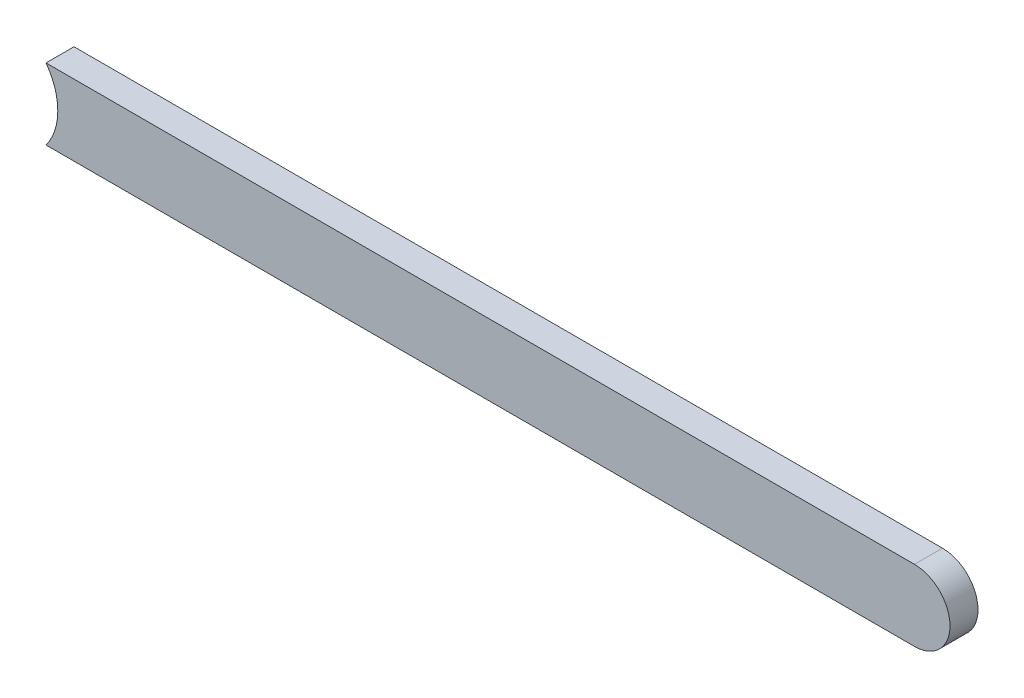
ISO-10303-21;
HEADER;
FILE_DESCRIPTION(('STEP AP214'),'2;1');
FILE_NAME('part.step','',(''),(''),'','','');
FILE_SCHEMA(('AUTOMOTIVE_DESIGN { 1 0 10303 214 1 1 1 1 }'));
ENDSEC;
DATA;
#1=APPLICATION_CONTEXT('core data for automotive mechanical design processes');
#2=APPLICATION_PROTOCOL_DEFINITION('international standard','automotive_design',2000,#1);
#3=PRODUCT_CONTEXT('',#1,'mechanical');
#4=PRODUCT('Part','Part','',(#3));
#5=PRODUCT_RELATED_PRODUCT_CATEGORY('part','',(#4));
#6=PRODUCT_DEFINITION_FORMATION('','',#4);
#7=PRODUCT_DEFINITION_CONTEXT('part definition',#1,'design');
#8=PRODUCT_DEFINITION('design','',#6,#7);
#9=PRODUCT_DEFINITION_SHAPE('','',#8);
#10=(LENGTH_UNIT() NAMED_UNIT(*) SI_UNIT(.MILLI.,.METRE.));
#11=(NAMED_UNIT(*) PLANE_ANGLE_UNIT() SI_UNIT($,.RADIAN.));
#12=(NAMED_UNIT(*) SI_UNIT($,.STERADIAN.) SOLID_ANGLE_UNIT());
#13=UNCERTAINTY_MEASURE_WITH_UNIT(LENGTH_MEASURE(1.E-05),#10,'distance_accuracy_value','');
#14=(GEOMETRIC_REPRESENTATION_CONTEXT(3) GLOBAL_UNCERTAINTY_ASSIGNED_CONTEXT((#13)) GLOBAL_UNIT_ASSIGNED_CONTEXT((#10,
#11,#12)) REPRESENTATION_CONTEXT('',''));
#15=CARTESIAN_POINT('',(0.,0.,0.));
#16=DIRECTION('',(0.,0.,1.));
#17=DIRECTION('',(1.,0.,0.));
#18=AXIS2_PLACEMENT_3D('',#15,#16,#17);
#19=CARTESIAN_POINT('',(110.830748231103,118.2974012,0.));
#20=DIRECTION('',(0.,1.,0.));
#21=DIRECTION('',(1.,0.,0.));
#22=AXIS2_PLACEMENT_3D('',#19,#20,#21);
#23=PLANE('',#22);
#24=DIRECTION('',(1.,0.,0.));
#25=VECTOR('',#24,1.);
#26=CARTESIAN_POINT('',(110.49,118.2974012,0.1999996));
#27=LINE('',#26,#25);
#28=CARTESIAN_POINT('',(110.830748231103,118.2974012,0.1999996));
#29=VERTEX_POINT('',#28);
#30=CARTESIAN_POINT('',(117.0335988,118.2974012,0.1999996));
#31=VERTEX_POINT('',#30);
#32=EDGE_CURVE('E11',#29,#31,#27,.T.);
#33=ORIENTED_EDGE('',*,*,#32,.F.);
#34=DIRECTION('',(0.,0.,1.));
#35=VECTOR('',#34,1.);
#36=CARTESIAN_POINT('',(110.830748231103,118.2974012,0.));
#37=LINE('',#36,#35);
#38=CARTESIAN_POINT('',(110.830748231103,118.2974012,0.));
#39=VERTEX_POINT('',#38);
#40=EDGE_CURVE('E24',#39,#29,#37,.T.);
#41=ORIENTED_EDGE('',*,*,#40,.F.);
#42=DIRECTION('',(1.,0.,0.));
#43=VECTOR('',#42,1.);
#44=CARTESIAN_POINT('',(110.49,118.2974012,0.));
#45=LINE('',#44,#43);
#46=CARTESIAN_POINT('',(117.0335988,118.2974012,0.));
#47=VERTEX_POINT('',#46);
#48=EDGE_CURVE('E82',#39,#47,#45,.T.);
#49=ORIENTED_EDGE('',*,*,#48,.T.);
#50=DIRECTION('',(0.,0.,1.));
#51=VECTOR('',#50,1.);
#52=CARTESIAN_POINT('',(117.0335988,118.2974012,0.));
#53=LINE('',#52,#51);
#54=EDGE_CURVE('E37',#47,#31,#53,.T.);
#55=ORIENTED_EDGE('',*,*,#54,.T.);
#56=EDGE_LOOP('',(#33,#41,#49,#55));
#57=FACE_BOUND('',#56,.T.);
#58=ADVANCED_FACE('F17',(#57),#23,.F.);
#59=CARTESIAN_POINT('',(117.0335988,118.5514012,0.));
#60=DIRECTION('',(0.,0.,-1.));
#61=DIRECTION('',(1.11896493820486E-13,-1.,0.));
#62=AXIS2_PLACEMENT_3D('',#59,#60,#61);
#63=CYLINDRICAL_SURFACE('',#62,0.25400000000001);
#64=CARTESIAN_POINT('',(117.0335988,118.5514012,0.1999996));
#65=DIRECTION('',(0.,0.,1.));
#66=DIRECTION('',(1.11896493820486E-13,-1.,0.));
#67=AXIS2_PLACEMENT_3D('',#64,#65,#66);
#68=CIRCLE('',#67,0.25400000000001);
#69=CARTESIAN_POINT('',(117.0335988,118.8054012,0.1999996));
#70=VERTEX_POINT('',#69);
#71=EDGE_CURVE('E97',#31,#70,#68,.T.);
#72=ORIENTED_EDGE('',*,*,#71,.F.);
#73=ORIENTED_EDGE('',*,*,#54,.F.);
#74=CARTESIAN_POINT('',(117.0335988,118.5514012,0.));
#75=DIRECTION('',(0.,0.,1.));
#76=DIRECTION('',(1.11896493820486E-13,-1.,0.));
#77=AXIS2_PLACEMENT_3D('',#74,#75,#76);
#78=CIRCLE('',#77,0.25400000000001);
#79=CARTESIAN_POINT('',(117.0335988,118.8054012,0.));
#80=VERTEX_POINT('',#79);
#81=EDGE_CURVE('E94',#47,#80,#78,.T.);
#82=ORIENTED_EDGE('',*,*,#81,.T.);
#83=DIRECTION('',(0.,0.,1.));
#84=VECTOR('',#83,1.);
#85=CARTESIAN_POINT('',(117.0335988,118.8054012,0.));
#86=LINE('',#85,#84);
#87=EDGE_CURVE('E92',#80,#70,#86,.T.);
#88=ORIENTED_EDGE('',*,*,#87,.T.);
#89=EDGE_LOOP('',(#72,#73,#82,#88));
#90=FACE_BOUND('',#89,.T.);
#91=ADVANCED_FACE('F103',(#90),#63,.T.);
#92=CARTESIAN_POINT('',(117.0335988,118.8054012,0.));
#93=DIRECTION('',(0.,-1.,0.));
#94=DIRECTION('',(-1.,0.,0.));
#95=AXIS2_PLACEMENT_3D('',#92,#93,#94);
#96=PLANE('',#95);
#97=DIRECTION('',(-1.,0.,0.));
#98=VECTOR('',#97,1.);
#99=CARTESIAN_POINT('',(117.0335988,118.8054012,0.1999996));
#100=LINE('',#99,#98);
#101=CARTESIAN_POINT('',(110.830748231103,118.8054012,0.1999996));
#102=VERTEX_POINT('',#101);
#103=EDGE_CURVE('E89',#70,#102,#100,.T.);
#104=ORIENTED_EDGE('',*,*,#103,.F.);
#105=ORIENTED_EDGE('',*,*,#87,.F.);
#106=DIRECTION('',(-1.,0.,0.));
#107=VECTOR('',#106,1.);
#108=CARTESIAN_POINT('',(117.0335988,118.8054012,0.));
#109=LINE('',#108,#107);
#110=CARTESIAN_POINT('',(110.830748231103,118.8054012,0.));
#111=VERTEX_POINT('',#110);
#112=EDGE_CURVE('E87',#80,#111,#109,.T.);
#113=ORIENTED_EDGE('',*,*,#112,.T.);
#114=DIRECTION('',(0.,0.,1.));
#115=VECTOR('',#114,1.);
#116=CARTESIAN_POINT('',(110.830748231103,118.8054012,0.));
#117=LINE('',#116,#115);
#118=EDGE_CURVE('E69',#111,#102,#117,.T.);
#119=ORIENTED_EDGE('',*,*,#118,.T.);
#120=EDGE_LOOP('',(#104,#105,#113,#119));
#121=FACE_BOUND('',#120,.T.);
#122=ADVANCED_FACE('F108',(#121),#96,.F.);
#123=CARTESIAN_POINT('',(110.49,118.5514012,0.));
#124=DIRECTION('',(0.,0.,-1.));
#125=DIRECTION('',(1.,0.,0.));
#126=AXIS2_PLACEMENT_3D('',#123,#124,#125);
#127=CYLINDRICAL_SURFACE('',#126,0.42500042);
#128=DIRECTION('',(0.,0.,1.));
#129=VECTOR('',#128,1.);
#130=CARTESIAN_POINT('',(110.91500042,118.5514012,0.));
#131=LINE('',#130,#129);
#132=CARTESIAN_POINT('',(110.91500042,118.5514012,0.));
#133=VERTEX_POINT('',#132);
#134=CARTESIAN_POINT('',(110.91500042,118.5514012,0.1999996));
#135=VERTEX_POINT('',#134);
#136=EDGE_CURVE('E59',#133,#135,#131,.T.);
#137=ORIENTED_EDGE('',*,*,#136,.T.);
#138=CARTESIAN_POINT('',(110.49,118.5514012,0.1999996));
#139=DIRECTION('',(0.,0.,1.));
#140=DIRECTION('',(1.,0.,0.));
#141=AXIS2_PLACEMENT_3D('',#138,#139,#140);
#142=CIRCLE('',#141,0.42500042);
#143=EDGE_CURVE('E70',#135,#102,#142,.T.);
#144=ORIENTED_EDGE('',*,*,#143,.T.);
#145=ORIENTED_EDGE('',*,*,#118,.F.);
#146=CARTESIAN_POINT('',(110.49,118.5514012,0.));
#147=DIRECTION('',(0.,0.,1.));
#148=DIRECTION('',(1.,0.,0.));
#149=AXIS2_PLACEMENT_3D('',#146,#147,#148);
#150=CIRCLE('',#149,0.42500042);
#151=EDGE_CURVE('E73',#133,#111,#150,.T.);
#152=ORIENTED_EDGE('',*,*,#151,.F.);
#153=EDGE_LOOP('',(#137,#144,#145,#152));
#154=FACE_BOUND('',#153,.T.);
#155=ADVANCED_FACE('F74',(#154),#127,.F.);
#156=CARTESIAN_POINT('',(110.49,118.5514012,0.));
#157=DIRECTION('',(0.,0.,-1.));
#158=DIRECTION('',(1.,0.,0.));
#159=AXIS2_PLACEMENT_3D('',#156,#157,#158);
#160=CYLINDRICAL_SURFACE('',#159,0.42500042);
#161=ORIENTED_EDGE('',*,*,#40,.T.);
#162=CARTESIAN_POINT('',(110.49,118.5514012,0.1999996));
#163=DIRECTION('',(0.,0.,1.));
#164=DIRECTION('',(1.,0.,0.));
#165=AXIS2_PLACEMENT_3D('',#162,#163,#164);
#166=CIRCLE('',#165,0.42500042);
#167=EDGE_CURVE('E65',#29,#135,#166,.T.);
#168=ORIENTED_EDGE('',*,*,#167,.T.);
#169=ORIENTED_EDGE('',*,*,#136,.F.);
#170=EDGE_CURVE('E63',#39,#133,#150,.T.);
#171=ORIENTED_EDGE('',*,*,#170,.F.);
#172=EDGE_LOOP('',(#161,#168,#169,#171));
#173=FACE_BOUND('',#172,.T.);
#174=ADVANCED_FACE('F61',(#173),#160,.F.);
#175=CARTESIAN_POINT('',(110.49,118.2974012,0.));
#176=DIRECTION('',(0.,0.,-1.));
#177=DIRECTION('',(-1.,0.,0.));
#178=AXIS2_PLACEMENT_3D('',#175,#176,#177);
#179=PLANE('',#178);
#180=ORIENTED_EDGE('',*,*,#48,.F.);
#181=ORIENTED_EDGE('',*,*,#170,.T.);
#182=ORIENTED_EDGE('',*,*,#151,.T.);
#183=ORIENTED_EDGE('',*,*,#112,.F.);
#184=ORIENTED_EDGE('',*,*,#81,.F.);
#185=EDGE_LOOP('',(#180,#181,#182,#183,#184));
#186=FACE_BOUND('',#185,.T.);
#187=ADVANCED_FACE('F80',(#186),#179,.T.);
#188=CARTESIAN_POINT('',(110.49,118.2974012,0.1999996));
#189=DIRECTION('',(0.,0.,-1.));
#190=DIRECTION('',(-1.,0.,0.));
#191=AXIS2_PLACEMENT_3D('',#188,#189,#190);
#192=PLANE('',#191);
#193=ORIENTED_EDGE('',*,*,#167,.F.);
#194=ORIENTED_EDGE('',*,*,#32,.T.);
#195=ORIENTED_EDGE('',*,*,#71,.T.);
#196=ORIENTED_EDGE('',*,*,#103,.T.);
#197=ORIENTED_EDGE('',*,*,#143,.F.);
#198=EDGE_LOOP('',(#193,#194,#195,#196,#197));
#199=FACE_BOUND('',#198,.T.);
#200=ADVANCED_FACE('F106',(#199),#192,.F.);
#201=CLOSED_SHELL('',(#58,#91,#122,#155,#174,#187,#200));
#202=MANIFOLD_SOLID_BREP('B1',#201);
#203=ADVANCED_BREP_SHAPE_REPRESENTATION('',(#18,#202),#14);
#204=SHAPE_DEFINITION_REPRESENTATION(#9,#203);
ENDSEC;
END-ISO-10303-21;
